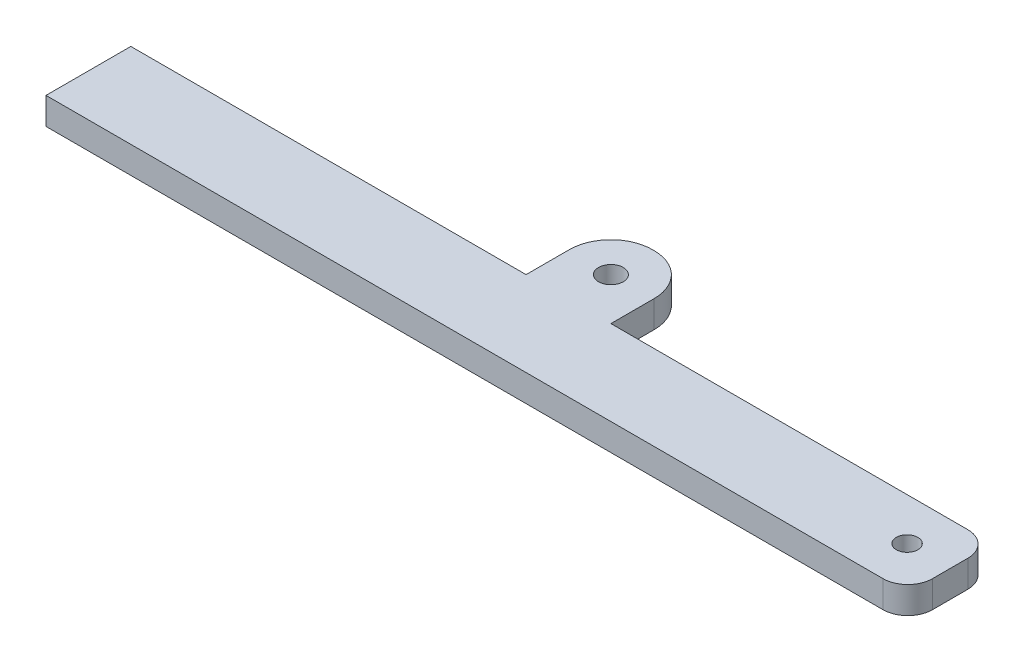
ISO-10303-21;
HEADER;
FILE_DESCRIPTION(('STEP AP214'),'2;1');
FILE_NAME('part.step','',(''),(''),'','','');
FILE_SCHEMA(('AUTOMOTIVE_DESIGN { 1 0 10303 214 1 1 1 1 }'));
ENDSEC;
DATA;
#1=APPLICATION_CONTEXT('core data for automotive mechanical design processes');
#2=APPLICATION_PROTOCOL_DEFINITION('international standard','automotive_design',2000,#1);
#3=PRODUCT_CONTEXT('',#1,'mechanical');
#4=PRODUCT('Part','Part','',(#3));
#5=PRODUCT_RELATED_PRODUCT_CATEGORY('part','',(#4));
#6=PRODUCT_DEFINITION_FORMATION('','',#4);
#7=PRODUCT_DEFINITION_CONTEXT('part definition',#1,'design');
#8=PRODUCT_DEFINITION('design','',#6,#7);
#9=PRODUCT_DEFINITION_SHAPE('','',#8);
#10=(LENGTH_UNIT() NAMED_UNIT(*) SI_UNIT(.MILLI.,.METRE.));
#11=(NAMED_UNIT(*) PLANE_ANGLE_UNIT() SI_UNIT($,.RADIAN.));
#12=(NAMED_UNIT(*) SI_UNIT($,.STERADIAN.) SOLID_ANGLE_UNIT());
#13=UNCERTAINTY_MEASURE_WITH_UNIT(LENGTH_MEASURE(1.E-05),#10,'distance_accuracy_value','');
#14=(GEOMETRIC_REPRESENTATION_CONTEXT(3) GLOBAL_UNCERTAINTY_ASSIGNED_CONTEXT((#13)) GLOBAL_UNIT_ASSIGNED_CONTEXT((#10,
#11,#12)) REPRESENTATION_CONTEXT('',''));
#15=CARTESIAN_POINT('',(0.,0.,0.));
#16=DIRECTION('',(0.,0.,1.));
#17=DIRECTION('',(1.,0.,0.));
#18=AXIS2_PLACEMENT_3D('',#15,#16,#17);
#19=CARTESIAN_POINT('',(51.5,3.175,-15.1));
#20=DIRECTION('',(0.,-1.,0.));
#21=DIRECTION('',(0.,0.,-1.));
#22=AXIS2_PLACEMENT_3D('',#19,#20,#21);
#23=PLANE('',#22);
#24=DIRECTION('',(1.,0.,0.));
#25=VECTOR('',#24,1.);
#26=CARTESIAN_POINT('',(0.,3.175,0.));
#27=LINE('',#26,#25);
#28=CARTESIAN_POINT('',(0.,3.175,0.));
#29=VERTEX_POINT('',#28);
#30=CARTESIAN_POINT('',(98.679,3.175,0.));
#31=VERTEX_POINT('',#30);
#32=EDGE_CURVE('E129',#29,#31,#27,.T.);
#33=ORIENTED_EDGE('',*,*,#32,.T.);
#34=CARTESIAN_POINT('',(98.679,3.175,-2.921));
#35=DIRECTION('',(0.,-1.,0.));
#36=DIRECTION('',(0.,0.,-1.));
#37=AXIS2_PLACEMENT_3D('',#34,#35,#36);
#38=CIRCLE('',#37,2.921);
#39=CARTESIAN_POINT('',(101.6,3.175,-2.921));
#40=VERTEX_POINT('',#39);
#41=EDGE_CURVE('E48',#31,#40,#38,.F.);
#42=ORIENTED_EDGE('',*,*,#41,.T.);
#43=DIRECTION('',(0.,0.,-1.));
#44=VECTOR('',#43,1.);
#45=CARTESIAN_POINT('',(101.6,3.175,0.));
#46=LINE('',#45,#44);
#47=CARTESIAN_POINT('',(101.6,3.175,-7.079));
#48=VERTEX_POINT('',#47);
#49=EDGE_CURVE('E137',#40,#48,#46,.T.);
#50=ORIENTED_EDGE('',*,*,#49,.T.);
#51=CARTESIAN_POINT('',(98.679,3.175,-7.079));
#52=DIRECTION('',(0.,-1.,0.));
#53=DIRECTION('',(0.,0.,-1.));
#54=AXIS2_PLACEMENT_3D('',#51,#52,#53);
#55=CIRCLE('',#54,2.921);
#56=CARTESIAN_POINT('',(98.679,3.175,-10.));
#57=VERTEX_POINT('',#56);
#58=EDGE_CURVE('E55',#48,#57,#55,.F.);
#59=ORIENTED_EDGE('',*,*,#58,.T.);
#60=DIRECTION('',(-1.,0.,0.));
#61=VECTOR('',#60,1.);
#62=CARTESIAN_POINT('',(56.6,3.175,-10.));
#63=LINE('',#62,#61);
#64=CARTESIAN_POINT('',(56.6,3.175,-10.));
#65=VERTEX_POINT('',#64);
#66=EDGE_CURVE('E190',#57,#65,#63,.T.);
#67=ORIENTED_EDGE('',*,*,#66,.T.);
#68=DIRECTION('',(0.,0.,-1.));
#69=VECTOR('',#68,1.);
#70=CARTESIAN_POINT('',(56.6,3.175,-10.));
#71=LINE('',#70,#69);
#72=CARTESIAN_POINT('',(56.6,3.175,-15.1));
#73=VERTEX_POINT('',#72);
#74=EDGE_CURVE('E293',#65,#73,#71,.T.);
#75=ORIENTED_EDGE('',*,*,#74,.T.);
#76=CARTESIAN_POINT('',(51.7,3.175,-15.1));
#77=DIRECTION('',(0.,1.,0.));
#78=DIRECTION('',(0.,0.,1.));
#79=AXIS2_PLACEMENT_3D('',#76,#77,#78);
#80=CIRCLE('',#79,4.9);
#81=CARTESIAN_POINT('',(51.7,3.175,-20.));
#82=VERTEX_POINT('',#81);
#83=EDGE_CURVE('E255',#73,#82,#80,.T.);
#84=ORIENTED_EDGE('',*,*,#83,.T.);
#85=DIRECTION('',(-1.,0.,0.));
#86=VECTOR('',#85,1.);
#87=CARTESIAN_POINT('',(51.5,3.175,-20.));
#88=LINE('',#87,#86);
#89=CARTESIAN_POINT('',(51.5,3.175,-20.));
#90=VERTEX_POINT('',#89);
#91=EDGE_CURVE('E275',#82,#90,#88,.T.);
#92=ORIENTED_EDGE('',*,*,#91,.T.);
#93=CARTESIAN_POINT('',(51.5,3.175,-15.1));
#94=DIRECTION('',(0.,1.,0.));
#95=DIRECTION('',(0.,0.,-1.));
#96=AXIS2_PLACEMENT_3D('',#93,#94,#95);
#97=CIRCLE('',#96,4.9);
#98=CARTESIAN_POINT('',(46.6,3.175,-15.1));
#99=VERTEX_POINT('',#98);
#100=EDGE_CURVE('E271',#90,#99,#97,.T.);
#101=ORIENTED_EDGE('',*,*,#100,.T.);
#102=DIRECTION('',(0.,0.,1.));
#103=VECTOR('',#102,1.);
#104=CARTESIAN_POINT('',(46.6,3.175,-10.));
#105=LINE('',#104,#103);
#106=CARTESIAN_POINT('',(46.6,3.175,-10.));
#107=VERTEX_POINT('',#106);
#108=EDGE_CURVE('E274',#99,#107,#105,.T.);
#109=ORIENTED_EDGE('',*,*,#108,.T.);
#110=DIRECTION('',(-1.,0.,0.));
#111=VECTOR('',#110,1.);
#112=CARTESIAN_POINT('',(0.,3.175,-10.));
#113=LINE('',#112,#111);
#114=CARTESIAN_POINT('',(0.,3.175,-10.));
#115=VERTEX_POINT('',#114);
#116=EDGE_CURVE('E143',#107,#115,#113,.T.);
#117=ORIENTED_EDGE('',*,*,#116,.T.);
#118=DIRECTION('',(0.,0.,1.));
#119=VECTOR('',#118,1.);
#120=CARTESIAN_POINT('',(0.,3.175,0.));
#121=LINE('',#120,#119);
#122=EDGE_CURVE('E138',#115,#29,#121,.T.);
#123=ORIENTED_EDGE('',*,*,#122,.T.);
#124=EDGE_LOOP('',(#33,#42,#50,#59,#67,#75,#84,#92,#101,#109,#117,#123));
#125=FACE_BOUND('',#124,.T.);
#126=CARTESIAN_POINT('',(51.6,3.175,-15.));
#127=DIRECTION('',(0.,1.,0.));
#128=DIRECTION('',(0.,0.,1.));
#129=AXIS2_PLACEMENT_3D('',#126,#127,#128);
#130=CIRCLE('',#129,1.46050000000001);
#131=CARTESIAN_POINT('',(51.6,3.175,-13.5395));
#132=VERTEX_POINT('',#131);
#133=EDGE_CURVE('E205',#132,#132,#130,.T.);
#134=ORIENTED_EDGE('',*,*,#133,.F.);
#135=EDGE_LOOP('',(#134));
#136=FACE_BOUND('',#135,.T.);
#137=CARTESIAN_POINT('',(96.52,3.175,-5.));
#138=DIRECTION('',(0.,1.,0.));
#139=DIRECTION('',(0.,0.,1.));
#140=AXIS2_PLACEMENT_3D('',#137,#138,#139);
#141=CIRCLE('',#140,1.27000000000001);
#142=CARTESIAN_POINT('',(96.52,3.175,-3.73));
#143=VERTEX_POINT('',#142);
#144=EDGE_CURVE('E302',#143,#143,#141,.T.);
#145=ORIENTED_EDGE('',*,*,#144,.F.);
#146=EDGE_LOOP('',(#145));
#147=FACE_BOUND('',#146,.T.);
#148=ADVANCED_FACE('F39',(#125,#136,#147),#23,.F.);
#149=CARTESIAN_POINT('',(51.5,0.,-15.1));
#150=DIRECTION('',(0.,-1.,0.));
#151=DIRECTION('',(0.,0.,-1.));
#152=AXIS2_PLACEMENT_3D('',#149,#150,#151);
#153=PLANE('',#152);
#154=CARTESIAN_POINT('',(51.6,0.,-15.));
#155=DIRECTION('',(0.,1.,0.));
#156=DIRECTION('',(0.,0.,1.));
#157=AXIS2_PLACEMENT_3D('',#154,#155,#156);
#158=CIRCLE('',#157,1.46050000000001);
#159=CARTESIAN_POINT('',(51.6,0.,-13.5395));
#160=VERTEX_POINT('',#159);
#161=EDGE_CURVE('E298',#160,#160,#158,.T.);
#162=ORIENTED_EDGE('',*,*,#161,.T.);
#163=EDGE_LOOP('',(#162));
#164=FACE_BOUND('',#163,.T.);
#165=DIRECTION('',(0.,0.,-1.));
#166=VECTOR('',#165,1.);
#167=CARTESIAN_POINT('',(101.6,0.,0.));
#168=LINE('',#167,#166);
#169=CARTESIAN_POINT('',(101.6,0.,-2.921));
#170=VERTEX_POINT('',#169);
#171=CARTESIAN_POINT('',(101.6,0.,-7.079));
#172=VERTEX_POINT('',#171);
#173=EDGE_CURVE('E197',#170,#172,#168,.T.);
#174=ORIENTED_EDGE('',*,*,#173,.F.);
#175=CARTESIAN_POINT('',(98.679,0.,-2.921));
#176=DIRECTION('',(0.,-1.,0.));
#177=DIRECTION('',(0.,0.,-1.));
#178=AXIS2_PLACEMENT_3D('',#175,#176,#177);
#179=CIRCLE('',#178,2.921);
#180=CARTESIAN_POINT('',(98.679,0.,0.));
#181=VERTEX_POINT('',#180);
#182=EDGE_CURVE('E173',#170,#181,#179,.T.);
#183=ORIENTED_EDGE('',*,*,#182,.T.);
#184=DIRECTION('',(1.,0.,0.));
#185=VECTOR('',#184,1.);
#186=CARTESIAN_POINT('',(0.,0.,0.));
#187=LINE('',#186,#185);
#188=CARTESIAN_POINT('',(0.,0.,0.));
#189=VERTEX_POINT('',#188);
#190=EDGE_CURVE('E196',#189,#181,#187,.T.);
#191=ORIENTED_EDGE('',*,*,#190,.F.);
#192=DIRECTION('',(0.,0.,1.));
#193=VECTOR('',#192,1.);
#194=CARTESIAN_POINT('',(0.,0.,0.));
#195=LINE('',#194,#193);
#196=CARTESIAN_POINT('',(0.,0.,-10.));
#197=VERTEX_POINT('',#196);
#198=EDGE_CURVE('E152',#197,#189,#195,.T.);
#199=ORIENTED_EDGE('',*,*,#198,.F.);
#200=DIRECTION('',(-1.,0.,0.));
#201=VECTOR('',#200,1.);
#202=CARTESIAN_POINT('',(0.,0.,-10.));
#203=LINE('',#202,#201);
#204=CARTESIAN_POINT('',(46.6,0.,-10.));
#205=VERTEX_POINT('',#204);
#206=EDGE_CURVE('E148',#205,#197,#203,.T.);
#207=ORIENTED_EDGE('',*,*,#206,.F.);
#208=DIRECTION('',(0.,0.,1.));
#209=VECTOR('',#208,1.);
#210=CARTESIAN_POINT('',(46.6,0.,-10.));
#211=LINE('',#210,#209);
#212=CARTESIAN_POINT('',(46.6,0.,-15.1));
#213=VERTEX_POINT('',#212);
#214=EDGE_CURVE('E223',#213,#205,#211,.T.);
#215=ORIENTED_EDGE('',*,*,#214,.F.);
#216=CARTESIAN_POINT('',(51.5,0.,-15.1));
#217=DIRECTION('',(0.,1.,0.));
#218=DIRECTION('',(0.,0.,-1.));
#219=AXIS2_PLACEMENT_3D('',#216,#217,#218);
#220=CIRCLE('',#219,4.9);
#221=CARTESIAN_POINT('',(51.5,0.,-20.));
#222=VERTEX_POINT('',#221);
#223=EDGE_CURVE('E220',#222,#213,#220,.T.);
#224=ORIENTED_EDGE('',*,*,#223,.F.);
#225=DIRECTION('',(-1.,0.,0.));
#226=VECTOR('',#225,1.);
#227=CARTESIAN_POINT('',(51.5,0.,-20.));
#228=LINE('',#227,#226);
#229=CARTESIAN_POINT('',(51.7,0.,-20.));
#230=VERTEX_POINT('',#229);
#231=EDGE_CURVE('E217',#230,#222,#228,.T.);
#232=ORIENTED_EDGE('',*,*,#231,.F.);
#233=CARTESIAN_POINT('',(51.7,0.,-15.1));
#234=DIRECTION('',(0.,1.,0.));
#235=DIRECTION('',(0.,0.,1.));
#236=AXIS2_PLACEMENT_3D('',#233,#234,#235);
#237=CIRCLE('',#236,4.9);
#238=CARTESIAN_POINT('',(56.6,0.,-15.1));
#239=VERTEX_POINT('',#238);
#240=EDGE_CURVE('E214',#239,#230,#237,.T.);
#241=ORIENTED_EDGE('',*,*,#240,.F.);
#242=DIRECTION('',(0.,0.,-1.));
#243=VECTOR('',#242,1.);
#244=CARTESIAN_POINT('',(56.6,0.,-10.));
#245=LINE('',#244,#243);
#246=CARTESIAN_POINT('',(56.6,0.,-10.));
#247=VERTEX_POINT('',#246);
#248=EDGE_CURVE('E211',#247,#239,#245,.T.);
#249=ORIENTED_EDGE('',*,*,#248,.F.);
#250=DIRECTION('',(-1.,0.,0.));
#251=VECTOR('',#250,1.);
#252=CARTESIAN_POINT('',(56.6,0.,-10.));
#253=LINE('',#252,#251);
#254=CARTESIAN_POINT('',(98.679,0.,-10.));
#255=VERTEX_POINT('',#254);
#256=EDGE_CURVE('E203',#255,#247,#253,.T.);
#257=ORIENTED_EDGE('',*,*,#256,.F.);
#258=CARTESIAN_POINT('',(98.679,0.,-7.079));
#259=DIRECTION('',(0.,-1.,0.));
#260=DIRECTION('',(0.,0.,-1.));
#261=AXIS2_PLACEMENT_3D('',#258,#259,#260);
#262=CIRCLE('',#261,2.921);
#263=EDGE_CURVE('E170',#255,#172,#262,.T.);
#264=ORIENTED_EDGE('',*,*,#263,.T.);
#265=EDGE_LOOP('',(#174,#183,#191,#199,#207,#215,#224,#232,#241,#249,#257,#264));
#266=FACE_BOUND('',#265,.T.);
#267=CARTESIAN_POINT('',(96.52,0.,-5.));
#268=DIRECTION('',(0.,1.,0.));
#269=DIRECTION('',(0.,0.,1.));
#270=AXIS2_PLACEMENT_3D('',#267,#268,#269);
#271=CIRCLE('',#270,1.27000000000001);
#272=CARTESIAN_POINT('',(96.52,0.,-3.73));
#273=VERTEX_POINT('',#272);
#274=EDGE_CURVE('E306',#273,#273,#271,.T.);
#275=ORIENTED_EDGE('',*,*,#274,.T.);
#276=EDGE_LOOP('',(#275));
#277=FACE_BOUND('',#276,.T.);
#278=ADVANCED_FACE('F194',(#164,#266,#277),#153,.T.);
#279=CARTESIAN_POINT('',(0.,3.175,0.));
#280=DIRECTION('',(1.,0.,0.));
#281=DIRECTION('',(0.,0.,-1.));
#282=AXIS2_PLACEMENT_3D('',#279,#280,#281);
#283=PLANE('',#282);
#284=ORIENTED_EDGE('',*,*,#198,.T.);
#285=DIRECTION('',(0.,-1.,0.));
#286=VECTOR('',#285,1.);
#287=CARTESIAN_POINT('',(0.,3.175,0.));
#288=LINE('',#287,#286);
#289=EDGE_CURVE('E133',#29,#189,#288,.T.);
#290=ORIENTED_EDGE('',*,*,#289,.F.);
#291=ORIENTED_EDGE('',*,*,#122,.F.);
#292=DIRECTION('',(0.,-1.,0.));
#293=VECTOR('',#292,1.);
#294=CARTESIAN_POINT('',(0.,3.175,-10.));
#295=LINE('',#294,#293);
#296=EDGE_CURVE('E228',#115,#197,#295,.T.);
#297=ORIENTED_EDGE('',*,*,#296,.T.);
#298=EDGE_LOOP('',(#284,#290,#291,#297));
#299=FACE_BOUND('',#298,.T.);
#300=ADVANCED_FACE('F150',(#299),#283,.F.);
#301=CARTESIAN_POINT('',(0.,3.175,0.));
#302=DIRECTION('',(0.,0.,-1.));
#303=DIRECTION('',(-1.,0.,0.));
#304=AXIS2_PLACEMENT_3D('',#301,#302,#303);
#305=PLANE('',#304);
#306=ORIENTED_EDGE('',*,*,#190,.T.);
#307=DIRECTION('',(0.,-1.,0.));
#308=VECTOR('',#307,1.);
#309=CARTESIAN_POINT('',(98.679,3.175,0.));
#310=LINE('',#309,#308);
#311=EDGE_CURVE('E63',#181,#31,#310,.F.);
#312=ORIENTED_EDGE('',*,*,#311,.T.);
#313=ORIENTED_EDGE('',*,*,#32,.F.);
#314=ORIENTED_EDGE('',*,*,#289,.T.);
#315=EDGE_LOOP('',(#306,#312,#313,#314));
#316=FACE_BOUND('',#315,.T.);
#317=ADVANCED_FACE('F131',(#316),#305,.F.);
#318=CARTESIAN_POINT('',(101.6,3.175,0.));
#319=DIRECTION('',(-1.,0.,0.));
#320=DIRECTION('',(0.,0.,1.));
#321=AXIS2_PLACEMENT_3D('',#318,#319,#320);
#322=PLANE('',#321);
#323=ORIENTED_EDGE('',*,*,#49,.F.);
#324=DIRECTION('',(0.,-1.,0.));
#325=VECTOR('',#324,1.);
#326=CARTESIAN_POINT('',(101.6,3.175,-2.921));
#327=LINE('',#326,#325);
#328=EDGE_CURVE('E160',#40,#170,#327,.T.);
#329=ORIENTED_EDGE('',*,*,#328,.T.);
#330=ORIENTED_EDGE('',*,*,#173,.T.);
#331=DIRECTION('',(0.,-1.,0.));
#332=VECTOR('',#331,1.);
#333=CARTESIAN_POINT('',(101.6,3.175,-7.079));
#334=LINE('',#333,#332);
#335=EDGE_CURVE('E154',#172,#48,#334,.F.);
#336=ORIENTED_EDGE('',*,*,#335,.T.);
#337=EDGE_LOOP('',(#323,#329,#330,#336));
#338=FACE_BOUND('',#337,.T.);
#339=ADVANCED_FACE('F185',(#338),#322,.F.);
#340=CARTESIAN_POINT('',(56.6,3.175,-10.));
#341=DIRECTION('',(0.,0.,1.));
#342=DIRECTION('',(1.,0.,0.));
#343=AXIS2_PLACEMENT_3D('',#340,#341,#342);
#344=PLANE('',#343);
#345=ORIENTED_EDGE('',*,*,#66,.F.);
#346=DIRECTION('',(0.,-1.,0.));
#347=VECTOR('',#346,1.);
#348=CARTESIAN_POINT('',(98.679,3.175,-10.));
#349=LINE('',#348,#347);
#350=EDGE_CURVE('E11',#57,#255,#349,.T.);
#351=ORIENTED_EDGE('',*,*,#350,.T.);
#352=ORIENTED_EDGE('',*,*,#256,.T.);
#353=DIRECTION('',(0.,-1.,0.));
#354=VECTOR('',#353,1.);
#355=CARTESIAN_POINT('',(56.6,3.175,-10.));
#356=LINE('',#355,#354);
#357=EDGE_CURVE('E155',#65,#247,#356,.T.);
#358=ORIENTED_EDGE('',*,*,#357,.F.);
#359=EDGE_LOOP('',(#345,#351,#352,#358));
#360=FACE_BOUND('',#359,.T.);
#361=ADVANCED_FACE('F346',(#360),#344,.F.);
#362=CARTESIAN_POINT('',(56.6,3.175,-10.));
#363=DIRECTION('',(-1.,0.,0.));
#364=DIRECTION('',(0.,0.,1.));
#365=AXIS2_PLACEMENT_3D('',#362,#363,#364);
#366=PLANE('',#365);
#367=ORIENTED_EDGE('',*,*,#248,.T.);
#368=DIRECTION('',(0.,-1.,0.));
#369=VECTOR('',#368,1.);
#370=CARTESIAN_POINT('',(56.6,3.175,-15.1));
#371=LINE('',#370,#369);
#372=EDGE_CURVE('E163',#73,#239,#371,.T.);
#373=ORIENTED_EDGE('',*,*,#372,.F.);
#374=ORIENTED_EDGE('',*,*,#74,.F.);
#375=ORIENTED_EDGE('',*,*,#357,.T.);
#376=EDGE_LOOP('',(#367,#373,#374,#375));
#377=FACE_BOUND('',#376,.T.);
#378=ADVANCED_FACE('F343',(#377),#366,.F.);
#379=CARTESIAN_POINT('',(51.7,3.175,-15.1));
#380=DIRECTION('',(0.,-1.,0.));
#381=DIRECTION('',(0.,0.,-1.));
#382=AXIS2_PLACEMENT_3D('',#379,#380,#381);
#383=CYLINDRICAL_SURFACE('',#382,4.9);
#384=ORIENTED_EDGE('',*,*,#240,.T.);
#385=DIRECTION('',(0.,-1.,0.));
#386=VECTOR('',#385,1.);
#387=CARTESIAN_POINT('',(51.7,3.175,-20.));
#388=LINE('',#387,#386);
#389=EDGE_CURVE('E243',#82,#230,#388,.T.);
#390=ORIENTED_EDGE('',*,*,#389,.F.);
#391=ORIENTED_EDGE('',*,*,#83,.F.);
#392=ORIENTED_EDGE('',*,*,#372,.T.);
#393=EDGE_LOOP('',(#384,#390,#391,#392));
#394=FACE_BOUND('',#393,.T.);
#395=ADVANCED_FACE('F253',(#394),#383,.T.);
#396=CARTESIAN_POINT('',(51.5,3.175,-20.));
#397=DIRECTION('',(0.,0.,1.));
#398=DIRECTION('',(1.,0.,0.));
#399=AXIS2_PLACEMENT_3D('',#396,#397,#398);
#400=PLANE('',#399);
#401=ORIENTED_EDGE('',*,*,#231,.T.);
#402=DIRECTION('',(0.,-1.,0.));
#403=VECTOR('',#402,1.);
#404=CARTESIAN_POINT('',(51.5,3.175,-20.));
#405=LINE('',#404,#403);
#406=EDGE_CURVE('E239',#90,#222,#405,.T.);
#407=ORIENTED_EDGE('',*,*,#406,.F.);
#408=ORIENTED_EDGE('',*,*,#91,.F.);
#409=ORIENTED_EDGE('',*,*,#389,.T.);
#410=EDGE_LOOP('',(#401,#407,#408,#409));
#411=FACE_BOUND('',#410,.T.);
#412=ADVANCED_FACE('F265',(#411),#400,.F.);
#413=CARTESIAN_POINT('',(51.5,3.175,-15.1));
#414=DIRECTION('',(0.,-1.,0.));
#415=DIRECTION('',(0.,0.,-1.));
#416=AXIS2_PLACEMENT_3D('',#413,#414,#415);
#417=CYLINDRICAL_SURFACE('',#416,4.9);
#418=ORIENTED_EDGE('',*,*,#223,.T.);
#419=DIRECTION('',(0.,-1.,0.));
#420=VECTOR('',#419,1.);
#421=CARTESIAN_POINT('',(46.6,3.175,-15.1));
#422=LINE('',#421,#420);
#423=EDGE_CURVE('E235',#99,#213,#422,.T.);
#424=ORIENTED_EDGE('',*,*,#423,.F.);
#425=ORIENTED_EDGE('',*,*,#100,.F.);
#426=ORIENTED_EDGE('',*,*,#406,.T.);
#427=EDGE_LOOP('',(#418,#424,#425,#426));
#428=FACE_BOUND('',#427,.T.);
#429=ADVANCED_FACE('F269',(#428),#417,.T.);
#430=CARTESIAN_POINT('',(46.6,3.175,-10.));
#431=DIRECTION('',(1.,0.,0.));
#432=DIRECTION('',(0.,0.,-1.));
#433=AXIS2_PLACEMENT_3D('',#430,#431,#432);
#434=PLANE('',#433);
#435=ORIENTED_EDGE('',*,*,#214,.T.);
#436=DIRECTION('',(0.,-1.,0.));
#437=VECTOR('',#436,1.);
#438=CARTESIAN_POINT('',(46.6,3.175,-10.));
#439=LINE('',#438,#437);
#440=EDGE_CURVE('E231',#107,#205,#439,.T.);
#441=ORIENTED_EDGE('',*,*,#440,.F.);
#442=ORIENTED_EDGE('',*,*,#108,.F.);
#443=ORIENTED_EDGE('',*,*,#423,.T.);
#444=EDGE_LOOP('',(#435,#441,#442,#443));
#445=FACE_BOUND('',#444,.T.);
#446=ADVANCED_FACE('F332',(#445),#434,.F.);
#447=CARTESIAN_POINT('',(0.,3.175,-10.));
#448=DIRECTION('',(0.,0.,1.));
#449=DIRECTION('',(1.,0.,0.));
#450=AXIS2_PLACEMENT_3D('',#447,#448,#449);
#451=PLANE('',#450);
#452=ORIENTED_EDGE('',*,*,#206,.T.);
#453=ORIENTED_EDGE('',*,*,#296,.F.);
#454=ORIENTED_EDGE('',*,*,#116,.F.);
#455=ORIENTED_EDGE('',*,*,#440,.T.);
#456=EDGE_LOOP('',(#452,#453,#454,#455));
#457=FACE_BOUND('',#456,.T.);
#458=ADVANCED_FACE('F329',(#457),#451,.F.);
#459=CARTESIAN_POINT('',(51.6,3.175,-15.));
#460=DIRECTION('',(0.,-1.,0.));
#461=DIRECTION('',(0.,0.,-1.));
#462=AXIS2_PLACEMENT_3D('',#459,#460,#461);
#463=CYLINDRICAL_SURFACE('',#462,1.46050000000001);
#464=ORIENTED_EDGE('',*,*,#133,.T.);
#465=EDGE_LOOP('',(#464));
#466=FACE_BOUND('',#465,.T.);
#467=ORIENTED_EDGE('',*,*,#161,.F.);
#468=EDGE_LOOP('',(#467));
#469=FACE_BOUND('',#468,.T.);
#470=ADVANCED_FACE('F326',(#466,#469),#463,.F.);
#471=CARTESIAN_POINT('',(96.52,3.175,-5.));
#472=DIRECTION('',(0.,-1.,0.));
#473=DIRECTION('',(0.,0.,-1.));
#474=AXIS2_PLACEMENT_3D('',#471,#472,#473);
#475=CYLINDRICAL_SURFACE('',#474,1.27000000000001);
#476=ORIENTED_EDGE('',*,*,#144,.T.);
#477=EDGE_LOOP('',(#476));
#478=FACE_BOUND('',#477,.T.);
#479=ORIENTED_EDGE('',*,*,#274,.F.);
#480=EDGE_LOOP('',(#479));
#481=FACE_BOUND('',#480,.T.);
#482=ADVANCED_FACE('F315',(#478,#481),#475,.F.);
#483=CARTESIAN_POINT('',(98.679,3.175,-2.921));
#484=DIRECTION('',(0.,-1.,0.));
#485=DIRECTION('',(0.,0.,-1.));
#486=AXIS2_PLACEMENT_3D('',#483,#484,#485);
#487=CYLINDRICAL_SURFACE('',#486,2.921);
#488=ORIENTED_EDGE('',*,*,#41,.F.);
#489=ORIENTED_EDGE('',*,*,#311,.F.);
#490=ORIENTED_EDGE('',*,*,#182,.F.);
#491=ORIENTED_EDGE('',*,*,#328,.F.);
#492=EDGE_LOOP('',(#488,#489,#490,#491));
#493=FACE_BOUND('',#492,.T.);
#494=ADVANCED_FACE('F192',(#493),#487,.T.);
#495=CARTESIAN_POINT('',(98.679,3.175,-7.079));
#496=DIRECTION('',(0.,-1.,0.));
#497=DIRECTION('',(0.,0.,-1.));
#498=AXIS2_PLACEMENT_3D('',#495,#496,#497);
#499=CYLINDRICAL_SURFACE('',#498,2.921);
#500=ORIENTED_EDGE('',*,*,#58,.F.);
#501=ORIENTED_EDGE('',*,*,#335,.F.);
#502=ORIENTED_EDGE('',*,*,#263,.F.);
#503=ORIENTED_EDGE('',*,*,#350,.F.);
#504=EDGE_LOOP('',(#500,#501,#502,#503));
#505=FACE_BOUND('',#504,.T.);
#506=ADVANCED_FACE('F41',(#505),#499,.T.);
#507=CLOSED_SHELL('',(#148,#278,#300,#317,#339,#361,#378,#395,#412,#429,#446,#458,#470,#482,
#494,#506));
#508=MANIFOLD_SOLID_BREP('B2',#507);
#509=ADVANCED_BREP_SHAPE_REPRESENTATION('',(#18,#508),#14);
#510=SHAPE_DEFINITION_REPRESENTATION(#9,#509);
ENDSEC;
END-ISO-10303-21;
